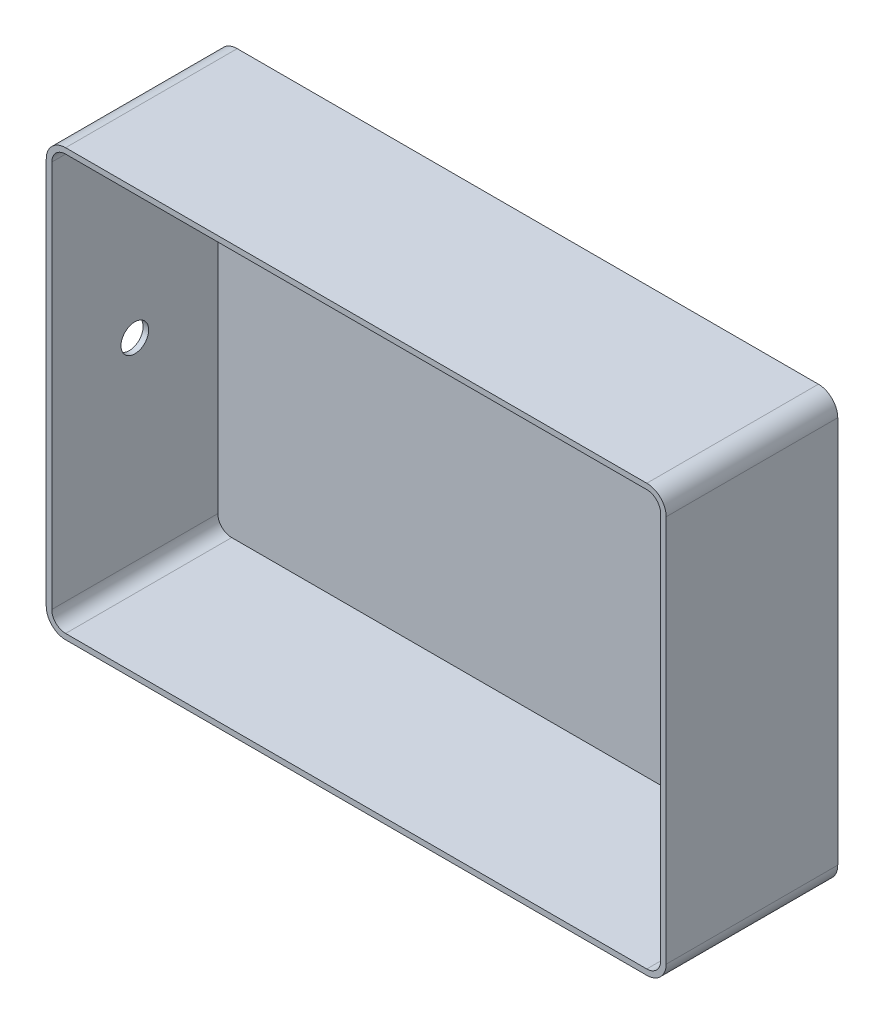
ISO-10303-21;
HEADER;
FILE_DESCRIPTION(('STEP AP214'),'2;1');
FILE_NAME('part.step','',(''),(''),'','','');
FILE_SCHEMA(('AUTOMOTIVE_DESIGN { 1 0 10303 214 1 1 1 1 }'));
ENDSEC;
DATA;
#1=APPLICATION_CONTEXT('core data for automotive mechanical design processes');
#2=APPLICATION_PROTOCOL_DEFINITION('international standard','automotive_design',2000,#1);
#3=PRODUCT_CONTEXT('',#1,'mechanical');
#4=PRODUCT('Part','Part','',(#3));
#5=PRODUCT_RELATED_PRODUCT_CATEGORY('part','',(#4));
#6=PRODUCT_DEFINITION_FORMATION('','',#4);
#7=PRODUCT_DEFINITION_CONTEXT('part definition',#1,'design');
#8=PRODUCT_DEFINITION('design','',#6,#7);
#9=PRODUCT_DEFINITION_SHAPE('','',#8);
#10=(LENGTH_UNIT() NAMED_UNIT(*) SI_UNIT(.MILLI.,.METRE.));
#11=(NAMED_UNIT(*) PLANE_ANGLE_UNIT() SI_UNIT($,.RADIAN.));
#12=(NAMED_UNIT(*) SI_UNIT($,.STERADIAN.) SOLID_ANGLE_UNIT());
#13=UNCERTAINTY_MEASURE_WITH_UNIT(LENGTH_MEASURE(1.E-05),#10,'distance_accuracy_value','');
#14=(GEOMETRIC_REPRESENTATION_CONTEXT(3) GLOBAL_UNCERTAINTY_ASSIGNED_CONTEXT((#13)) GLOBAL_UNIT_ASSIGNED_CONTEXT((#10,
#11,#12)) REPRESENTATION_CONTEXT('',''));
#15=CARTESIAN_POINT('',(0.,0.,0.));
#16=DIRECTION('',(0.,0.,1.));
#17=DIRECTION('',(1.,0.,0.));
#18=AXIS2_PLACEMENT_3D('',#15,#16,#17);
#19=CARTESIAN_POINT('',(105.,-70.,30.));
#20=DIRECTION('',(0.,0.,-1.));
#21=DIRECTION('',(-1.,0.,0.));
#22=AXIS2_PLACEMENT_3D('',#19,#20,#21);
#23=CYLINDRICAL_SURFACE('',#22,7.);
#24=CARTESIAN_POINT('',(105.,-70.,-32.));
#25=DIRECTION('',(0.,0.,1.));
#26=DIRECTION('',(1.,0.,0.));
#27=AXIS2_PLACEMENT_3D('',#24,#25,#26);
#28=CIRCLE('',#27,7.);
#29=CARTESIAN_POINT('',(105.,-77.,-32.));
#30=VERTEX_POINT('',#29);
#31=CARTESIAN_POINT('',(112.,-69.9999999999999,-32.));
#32=VERTEX_POINT('',#31);
#33=EDGE_CURVE('E186',#30,#32,#28,.T.);
#34=ORIENTED_EDGE('',*,*,#33,.T.);
#35=DIRECTION('',(0.,0.,1.));
#36=VECTOR('',#35,1.);
#37=CARTESIAN_POINT('',(112.,-69.9999999999999,30.));
#38=LINE('',#37,#36);
#39=CARTESIAN_POINT('',(112.,-69.9999999999999,30.));
#40=VERTEX_POINT('',#39);
#41=EDGE_CURVE('E11',#40,#32,#38,.F.);
#42=ORIENTED_EDGE('',*,*,#41,.F.);
#43=CARTESIAN_POINT('',(105.,-70.,30.));
#44=DIRECTION('',(0.,0.,1.));
#45=DIRECTION('',(1.,0.,0.));
#46=AXIS2_PLACEMENT_3D('',#43,#44,#45);
#47=CIRCLE('',#46,7.);
#48=CARTESIAN_POINT('',(105.,-77.,30.));
#49=VERTEX_POINT('',#48);
#50=EDGE_CURVE('E309',#49,#40,#47,.T.);
#51=ORIENTED_EDGE('',*,*,#50,.F.);
#52=DIRECTION('',(0.,0.,-1.));
#53=VECTOR('',#52,1.);
#54=CARTESIAN_POINT('',(105.,-77.,30.));
#55=LINE('',#54,#53);
#56=EDGE_CURVE('E262',#49,#30,#55,.T.);
#57=ORIENTED_EDGE('',*,*,#56,.T.);
#58=EDGE_LOOP('',(#34,#42,#51,#57));
#59=FACE_BOUND('',#58,.T.);
#60=ADVANCED_FACE('F46',(#59),#23,.T.);
#61=CARTESIAN_POINT('',(112.,-69.9999999999999,30.));
#62=DIRECTION('',(-1.,0.,0.));
#63=DIRECTION('',(0.,-1.,0.));
#64=AXIS2_PLACEMENT_3D('',#61,#62,#63);
#65=PLANE('',#64);
#66=DIRECTION('',(0.,1.,0.));
#67=VECTOR('',#66,1.);
#68=CARTESIAN_POINT('',(112.,-69.9999999999999,-32.));
#69=LINE('',#68,#67);
#70=CARTESIAN_POINT('',(112.,70.,-32.));
#71=VERTEX_POINT('',#70);
#72=EDGE_CURVE('E260',#32,#71,#69,.T.);
#73=ORIENTED_EDGE('',*,*,#72,.T.);
#74=DIRECTION('',(0.,0.,-1.));
#75=VECTOR('',#74,1.);
#76=CARTESIAN_POINT('',(112.,70.,30.));
#77=LINE('',#76,#75);
#78=CARTESIAN_POINT('',(112.,70.,30.));
#79=VERTEX_POINT('',#78);
#80=EDGE_CURVE('E56',#79,#71,#77,.T.);
#81=ORIENTED_EDGE('',*,*,#80,.F.);
#82=DIRECTION('',(0.,1.,0.));
#83=VECTOR('',#82,1.);
#84=CARTESIAN_POINT('',(112.,-69.9999999999999,30.));
#85=LINE('',#84,#83);
#86=EDGE_CURVE('E312',#40,#79,#85,.T.);
#87=ORIENTED_EDGE('',*,*,#86,.F.);
#88=ORIENTED_EDGE('',*,*,#41,.T.);
#89=EDGE_LOOP('',(#73,#81,#87,#88));
#90=FACE_BOUND('',#89,.T.);
#91=ADVANCED_FACE('F348',(#90),#65,.F.);
#92=CARTESIAN_POINT('',(105.,70.,30.));
#93=DIRECTION('',(0.,0.,-1.));
#94=DIRECTION('',(-1.,0.,0.));
#95=AXIS2_PLACEMENT_3D('',#92,#93,#94);
#96=CYLINDRICAL_SURFACE('',#95,7.);
#97=CARTESIAN_POINT('',(105.,70.,-32.));
#98=DIRECTION('',(0.,0.,1.));
#99=DIRECTION('',(1.,0.,0.));
#100=AXIS2_PLACEMENT_3D('',#97,#98,#99);
#101=CIRCLE('',#100,7.);
#102=CARTESIAN_POINT('',(105.,77.,-32.));
#103=VERTEX_POINT('',#102);
#104=EDGE_CURVE('E269',#71,#103,#101,.T.);
#105=ORIENTED_EDGE('',*,*,#104,.T.);
#106=DIRECTION('',(0.,0.,1.));
#107=VECTOR('',#106,1.);
#108=CARTESIAN_POINT('',(105.,77.,30.));
#109=LINE('',#108,#107);
#110=CARTESIAN_POINT('',(105.,77.,30.));
#111=VERTEX_POINT('',#110);
#112=EDGE_CURVE('E273',#111,#103,#109,.F.);
#113=ORIENTED_EDGE('',*,*,#112,.F.);
#114=CARTESIAN_POINT('',(105.,70.,30.));
#115=DIRECTION('',(0.,0.,1.));
#116=DIRECTION('',(1.,0.,0.));
#117=AXIS2_PLACEMENT_3D('',#114,#115,#116);
#118=CIRCLE('',#117,7.);
#119=EDGE_CURVE('E315',#79,#111,#118,.T.);
#120=ORIENTED_EDGE('',*,*,#119,.F.);
#121=ORIENTED_EDGE('',*,*,#80,.T.);
#122=EDGE_LOOP('',(#105,#113,#120,#121));
#123=FACE_BOUND('',#122,.T.);
#124=ADVANCED_FACE('F351',(#123),#96,.T.);
#125=CARTESIAN_POINT('',(-105.,77.,30.));
#126=DIRECTION('',(0.,-1.,0.));
#127=DIRECTION('',(1.,0.,0.));
#128=AXIS2_PLACEMENT_3D('',#125,#126,#127);
#129=PLANE('',#128);
#130=DIRECTION('',(-1.,0.,0.));
#131=VECTOR('',#130,1.);
#132=CARTESIAN_POINT('',(-105.,77.,-32.));
#133=LINE('',#132,#131);
#134=CARTESIAN_POINT('',(-105.,77.,-32.));
#135=VERTEX_POINT('',#134);
#136=EDGE_CURVE('E276',#103,#135,#133,.T.);
#137=ORIENTED_EDGE('',*,*,#136,.T.);
#138=DIRECTION('',(0.,0.,-1.));
#139=VECTOR('',#138,1.);
#140=CARTESIAN_POINT('',(-105.,77.,30.));
#141=LINE('',#140,#139);
#142=CARTESIAN_POINT('',(-105.,77.,30.));
#143=VERTEX_POINT('',#142);
#144=EDGE_CURVE('E280',#143,#135,#141,.T.);
#145=ORIENTED_EDGE('',*,*,#144,.F.);
#146=DIRECTION('',(-1.,0.,0.));
#147=VECTOR('',#146,1.);
#148=CARTESIAN_POINT('',(-105.,77.,30.));
#149=LINE('',#148,#147);
#150=EDGE_CURVE('E318',#111,#143,#149,.T.);
#151=ORIENTED_EDGE('',*,*,#150,.F.);
#152=ORIENTED_EDGE('',*,*,#112,.T.);
#153=EDGE_LOOP('',(#137,#145,#151,#152));
#154=FACE_BOUND('',#153,.T.);
#155=ADVANCED_FACE('F356',(#154),#129,.F.);
#156=CARTESIAN_POINT('',(-105.,70.,30.));
#157=DIRECTION('',(0.,0.,-1.));
#158=DIRECTION('',(-1.,0.,0.));
#159=AXIS2_PLACEMENT_3D('',#156,#157,#158);
#160=CYLINDRICAL_SURFACE('',#159,7.);
#161=CARTESIAN_POINT('',(-105.,70.,-32.));
#162=DIRECTION('',(0.,0.,1.));
#163=DIRECTION('',(1.,0.,0.));
#164=AXIS2_PLACEMENT_3D('',#161,#162,#163);
#165=CIRCLE('',#164,7.);
#166=CARTESIAN_POINT('',(-112.,70.,-32.));
#167=VERTEX_POINT('',#166);
#168=EDGE_CURVE('E283',#135,#167,#165,.T.);
#169=ORIENTED_EDGE('',*,*,#168,.T.);
#170=DIRECTION('',(0.,0.,1.));
#171=VECTOR('',#170,1.);
#172=CARTESIAN_POINT('',(-112.,70.,30.));
#173=LINE('',#172,#171);
#174=CARTESIAN_POINT('',(-112.,70.,30.));
#175=VERTEX_POINT('',#174);
#176=EDGE_CURVE('E287',#175,#167,#173,.F.);
#177=ORIENTED_EDGE('',*,*,#176,.F.);
#178=CARTESIAN_POINT('',(-105.,70.,30.));
#179=DIRECTION('',(0.,0.,1.));
#180=DIRECTION('',(1.,0.,0.));
#181=AXIS2_PLACEMENT_3D('',#178,#179,#180);
#182=CIRCLE('',#181,7.);
#183=EDGE_CURVE('E321',#143,#175,#182,.T.);
#184=ORIENTED_EDGE('',*,*,#183,.F.);
#185=ORIENTED_EDGE('',*,*,#144,.T.);
#186=EDGE_LOOP('',(#169,#177,#184,#185));
#187=FACE_BOUND('',#186,.T.);
#188=ADVANCED_FACE('F360',(#187),#160,.T.);
#189=CARTESIAN_POINT('',(-112.,-69.9999999999999,30.));
#190=DIRECTION('',(1.,0.,0.));
#191=DIRECTION('',(0.,1.,0.));
#192=AXIS2_PLACEMENT_3D('',#189,#190,#191);
#193=PLANE('',#192);
#194=CARTESIAN_POINT('',(-112.,0.,0.));
#195=DIRECTION('',(-1.,0.,0.));
#196=DIRECTION('',(0.,-1.,0.));
#197=AXIS2_PLACEMENT_3D('',#194,#195,#196);
#198=CIRCLE('',#197,5.);
#199=CARTESIAN_POINT('',(-112.,-5.00000000000001,0.));
#200=VERTEX_POINT('',#199);
#201=EDGE_CURVE('E538',#200,#200,#198,.T.);
#202=ORIENTED_EDGE('',*,*,#201,.F.);
#203=EDGE_LOOP('',(#202));
#204=FACE_BOUND('',#203,.T.);
#205=DIRECTION('',(0.,-1.,0.));
#206=VECTOR('',#205,1.);
#207=CARTESIAN_POINT('',(-112.,-69.9999999999999,-32.));
#208=LINE('',#207,#206);
#209=CARTESIAN_POINT('',(-112.,-70.,-32.));
#210=VERTEX_POINT('',#209);
#211=EDGE_CURVE('E290',#167,#210,#208,.T.);
#212=ORIENTED_EDGE('',*,*,#211,.T.);
#213=DIRECTION('',(0.,0.,-1.));
#214=VECTOR('',#213,1.);
#215=CARTESIAN_POINT('',(-112.,-70.,30.));
#216=LINE('',#215,#214);
#217=CARTESIAN_POINT('',(-112.,-70.,30.));
#218=VERTEX_POINT('',#217);
#219=EDGE_CURVE('E294',#218,#210,#216,.T.);
#220=ORIENTED_EDGE('',*,*,#219,.F.);
#221=DIRECTION('',(0.,-1.,0.));
#222=VECTOR('',#221,1.);
#223=CARTESIAN_POINT('',(-112.,-69.9999999999999,30.));
#224=LINE('',#223,#222);
#225=EDGE_CURVE('E324',#175,#218,#224,.T.);
#226=ORIENTED_EDGE('',*,*,#225,.F.);
#227=ORIENTED_EDGE('',*,*,#176,.T.);
#228=EDGE_LOOP('',(#212,#220,#226,#227));
#229=FACE_BOUND('',#228,.T.);
#230=ADVANCED_FACE('F364',(#204,#229),#193,.F.);
#231=CARTESIAN_POINT('',(-105.,-70.,30.));
#232=DIRECTION('',(0.,0.,-1.));
#233=DIRECTION('',(-1.,0.,0.));
#234=AXIS2_PLACEMENT_3D('',#231,#232,#233);
#235=CYLINDRICAL_SURFACE('',#234,7.);
#236=CARTESIAN_POINT('',(-105.,-70.,-32.));
#237=DIRECTION('',(0.,0.,1.));
#238=DIRECTION('',(1.,0.,0.));
#239=AXIS2_PLACEMENT_3D('',#236,#237,#238);
#240=CIRCLE('',#239,7.);
#241=CARTESIAN_POINT('',(-105.,-77.,-32.));
#242=VERTEX_POINT('',#241);
#243=EDGE_CURVE('E297',#210,#242,#240,.T.);
#244=ORIENTED_EDGE('',*,*,#243,.T.);
#245=DIRECTION('',(0.,0.,1.));
#246=VECTOR('',#245,1.);
#247=CARTESIAN_POINT('',(-105.,-77.,30.));
#248=LINE('',#247,#246);
#249=CARTESIAN_POINT('',(-105.,-77.,30.));
#250=VERTEX_POINT('',#249);
#251=EDGE_CURVE('E266',#250,#242,#248,.F.);
#252=ORIENTED_EDGE('',*,*,#251,.F.);
#253=CARTESIAN_POINT('',(-105.,-70.,30.));
#254=DIRECTION('',(0.,0.,1.));
#255=DIRECTION('',(1.,0.,0.));
#256=AXIS2_PLACEMENT_3D('',#253,#254,#255);
#257=CIRCLE('',#256,7.);
#258=EDGE_CURVE('E327',#218,#250,#257,.T.);
#259=ORIENTED_EDGE('',*,*,#258,.F.);
#260=ORIENTED_EDGE('',*,*,#219,.T.);
#261=EDGE_LOOP('',(#244,#252,#259,#260));
#262=FACE_BOUND('',#261,.T.);
#263=ADVANCED_FACE('F335',(#262),#235,.T.);
#264=CARTESIAN_POINT('',(-105.,-77.,30.));
#265=DIRECTION('',(0.,1.,0.));
#266=DIRECTION('',(0.,0.,1.));
#267=AXIS2_PLACEMENT_3D('',#264,#265,#266);
#268=PLANE('',#267);
#269=DIRECTION('',(1.,0.,0.));
#270=VECTOR('',#269,1.);
#271=CARTESIAN_POINT('',(-105.,-77.,-32.));
#272=LINE('',#271,#270);
#273=EDGE_CURVE('E303',#242,#30,#272,.T.);
#274=ORIENTED_EDGE('',*,*,#273,.T.);
#275=ORIENTED_EDGE('',*,*,#56,.F.);
#276=DIRECTION('',(1.,0.,0.));
#277=VECTOR('',#276,1.);
#278=CARTESIAN_POINT('',(-105.,-77.,30.));
#279=LINE('',#278,#277);
#280=EDGE_CURVE('E72',#250,#49,#279,.T.);
#281=ORIENTED_EDGE('',*,*,#280,.F.);
#282=ORIENTED_EDGE('',*,*,#251,.T.);
#283=EDGE_LOOP('',(#274,#275,#281,#282));
#284=FACE_BOUND('',#283,.T.);
#285=ADVANCED_FACE('F339',(#284),#268,.F.);
#286=CARTESIAN_POINT('',(105.,-70.,30.));
#287=DIRECTION('',(0.,0.,1.));
#288=DIRECTION('',(1.,0.,0.));
#289=AXIS2_PLACEMENT_3D('',#286,#287,#288);
#290=PLANE('',#289);
#291=CARTESIAN_POINT('',(105.,-70.,30.));
#292=DIRECTION('',(0.,0.,1.));
#293=DIRECTION('',(1.,0.,0.));
#294=AXIS2_PLACEMENT_3D('',#291,#292,#293);
#295=CIRCLE('',#294,5.);
#296=CARTESIAN_POINT('',(105.,-75.,30.));
#297=VERTEX_POINT('',#296);
#298=CARTESIAN_POINT('',(110.,-69.9999999999999,30.));
#299=VERTEX_POINT('',#298);
#300=EDGE_CURVE('E165',#297,#299,#295,.T.);
#301=ORIENTED_EDGE('',*,*,#300,.F.);
#302=DIRECTION('',(1.,0.,0.));
#303=VECTOR('',#302,1.);
#304=CARTESIAN_POINT('',(-105.,-75.,30.));
#305=LINE('',#304,#303);
#306=CARTESIAN_POINT('',(-105.,-75.,30.));
#307=VERTEX_POINT('',#306);
#308=EDGE_CURVE('E211',#307,#297,#305,.T.);
#309=ORIENTED_EDGE('',*,*,#308,.F.);
#310=CARTESIAN_POINT('',(-105.,-70.,30.));
#311=DIRECTION('',(0.,0.,1.));
#312=DIRECTION('',(-1.,0.,0.));
#313=AXIS2_PLACEMENT_3D('',#310,#311,#312);
#314=CIRCLE('',#313,5.);
#315=CARTESIAN_POINT('',(-110.,-70.,30.));
#316=VERTEX_POINT('',#315);
#317=EDGE_CURVE('E208',#316,#307,#314,.T.);
#318=ORIENTED_EDGE('',*,*,#317,.F.);
#319=DIRECTION('',(0.,-1.,0.));
#320=VECTOR('',#319,1.);
#321=CARTESIAN_POINT('',(-110.,-69.9999999999999,30.));
#322=LINE('',#321,#320);
#323=CARTESIAN_POINT('',(-110.,70.,30.));
#324=VERTEX_POINT('',#323);
#325=EDGE_CURVE('E205',#324,#316,#322,.T.);
#326=ORIENTED_EDGE('',*,*,#325,.F.);
#327=CARTESIAN_POINT('',(-105.,70.,30.));
#328=DIRECTION('',(0.,0.,1.));
#329=DIRECTION('',(-1.,0.,0.));
#330=AXIS2_PLACEMENT_3D('',#327,#328,#329);
#331=CIRCLE('',#330,5.);
#332=CARTESIAN_POINT('',(-105.,75.,30.));
#333=VERTEX_POINT('',#332);
#334=EDGE_CURVE('E202',#333,#324,#331,.T.);
#335=ORIENTED_EDGE('',*,*,#334,.F.);
#336=DIRECTION('',(-1.,0.,0.));
#337=VECTOR('',#336,1.);
#338=CARTESIAN_POINT('',(-105.,75.,30.));
#339=LINE('',#338,#337);
#340=CARTESIAN_POINT('',(105.,75.,30.));
#341=VERTEX_POINT('',#340);
#342=EDGE_CURVE('E196',#341,#333,#339,.T.);
#343=ORIENTED_EDGE('',*,*,#342,.F.);
#344=CARTESIAN_POINT('',(105.,70.,30.));
#345=DIRECTION('',(0.,0.,1.));
#346=DIRECTION('',(-1.,0.,0.));
#347=AXIS2_PLACEMENT_3D('',#344,#345,#346);
#348=CIRCLE('',#347,5.);
#349=CARTESIAN_POINT('',(110.,70.,30.));
#350=VERTEX_POINT('',#349);
#351=EDGE_CURVE('E192',#350,#341,#348,.T.);
#352=ORIENTED_EDGE('',*,*,#351,.F.);
#353=DIRECTION('',(0.,1.,0.));
#354=VECTOR('',#353,1.);
#355=CARTESIAN_POINT('',(110.,-69.9999999999999,30.));
#356=LINE('',#355,#354);
#357=EDGE_CURVE('E177',#299,#350,#356,.T.);
#358=ORIENTED_EDGE('',*,*,#357,.F.);
#359=EDGE_LOOP('',(#301,#309,#318,#326,#335,#343,#352,#358));
#360=FACE_BOUND('',#359,.T.);
#361=ORIENTED_EDGE('',*,*,#50,.T.);
#362=ORIENTED_EDGE('',*,*,#86,.T.);
#363=ORIENTED_EDGE('',*,*,#119,.T.);
#364=ORIENTED_EDGE('',*,*,#150,.T.);
#365=ORIENTED_EDGE('',*,*,#183,.T.);
#366=ORIENTED_EDGE('',*,*,#225,.T.);
#367=ORIENTED_EDGE('',*,*,#258,.T.);
#368=ORIENTED_EDGE('',*,*,#280,.T.);
#369=EDGE_LOOP('',(#361,#362,#363,#364,#365,#366,#367,#368));
#370=FACE_BOUND('',#369,.T.);
#371=ADVANCED_FACE('F190',(#360,#370),#290,.T.);
#372=CARTESIAN_POINT('',(105.,-70.,-32.));
#373=DIRECTION('',(0.,0.,1.));
#374=DIRECTION('',(1.,0.,0.));
#375=AXIS2_PLACEMENT_3D('',#372,#373,#374);
#376=PLANE('',#375);
#377=ORIENTED_EDGE('',*,*,#33,.F.);
#378=ORIENTED_EDGE('',*,*,#273,.F.);
#379=ORIENTED_EDGE('',*,*,#243,.F.);
#380=ORIENTED_EDGE('',*,*,#211,.F.);
#381=ORIENTED_EDGE('',*,*,#168,.F.);
#382=ORIENTED_EDGE('',*,*,#136,.F.);
#383=ORIENTED_EDGE('',*,*,#104,.F.);
#384=ORIENTED_EDGE('',*,*,#72,.F.);
#385=EDGE_LOOP('',(#377,#378,#379,#380,#381,#382,#383,#384));
#386=FACE_BOUND('',#385,.T.);
#387=ADVANCED_FACE('F48',(#386),#376,.F.);
#388=CARTESIAN_POINT('',(105.,-70.,30.));
#389=DIRECTION('',(0.,0.,-1.));
#390=DIRECTION('',(-1.,0.,0.));
#391=AXIS2_PLACEMENT_3D('',#388,#389,#390);
#392=CYLINDRICAL_SURFACE('',#391,5.);
#393=CARTESIAN_POINT('',(105.,-70.,-30.));
#394=DIRECTION('',(0.,0.,1.));
#395=DIRECTION('',(1.,0.,0.));
#396=AXIS2_PLACEMENT_3D('',#393,#394,#395);
#397=CIRCLE('',#396,5.);
#398=CARTESIAN_POINT('',(105.,-75.,-30.));
#399=VERTEX_POINT('',#398);
#400=CARTESIAN_POINT('',(110.,-69.9999999999999,-30.));
#401=VERTEX_POINT('',#400);
#402=EDGE_CURVE('E214',#399,#401,#397,.T.);
#403=ORIENTED_EDGE('',*,*,#402,.F.);
#404=DIRECTION('',(0.,0.,-1.));
#405=VECTOR('',#404,1.);
#406=CARTESIAN_POINT('',(105.,-75.,30.));
#407=LINE('',#406,#405);
#408=EDGE_CURVE('E172',#297,#399,#407,.T.);
#409=ORIENTED_EDGE('',*,*,#408,.F.);
#410=ORIENTED_EDGE('',*,*,#300,.T.);
#411=DIRECTION('',(0.,0.,-1.));
#412=VECTOR('',#411,1.);
#413=CARTESIAN_POINT('',(110.,-69.9999999999999,30.));
#414=LINE('',#413,#412);
#415=EDGE_CURVE('E169',#299,#401,#414,.T.);
#416=ORIENTED_EDGE('',*,*,#415,.T.);
#417=EDGE_LOOP('',(#403,#409,#410,#416));
#418=FACE_BOUND('',#417,.T.);
#419=ADVANCED_FACE('F168',(#418),#392,.F.);
#420=CARTESIAN_POINT('',(110.,-69.9999999999999,30.));
#421=DIRECTION('',(-1.,0.,0.));
#422=DIRECTION('',(0.,-1.,0.));
#423=AXIS2_PLACEMENT_3D('',#420,#421,#422);
#424=PLANE('',#423);
#425=DIRECTION('',(0.,1.,0.));
#426=VECTOR('',#425,1.);
#427=CARTESIAN_POINT('',(110.,-69.9999999999999,-30.));
#428=LINE('',#427,#426);
#429=CARTESIAN_POINT('',(110.,70.,-30.));
#430=VERTEX_POINT('',#429);
#431=EDGE_CURVE('E184',#401,#430,#428,.T.);
#432=ORIENTED_EDGE('',*,*,#431,.F.);
#433=ORIENTED_EDGE('',*,*,#415,.F.);
#434=ORIENTED_EDGE('',*,*,#357,.T.);
#435=DIRECTION('',(0.,0.,-1.));
#436=VECTOR('',#435,1.);
#437=CARTESIAN_POINT('',(110.,70.,30.));
#438=LINE('',#437,#436);
#439=EDGE_CURVE('E187',#350,#430,#438,.T.);
#440=ORIENTED_EDGE('',*,*,#439,.T.);
#441=EDGE_LOOP('',(#432,#433,#434,#440));
#442=FACE_BOUND('',#441,.T.);
#443=ADVANCED_FACE('F181',(#442),#424,.T.);
#444=CARTESIAN_POINT('',(105.,70.,30.));
#445=DIRECTION('',(0.,0.,-1.));
#446=DIRECTION('',(-1.,0.,0.));
#447=AXIS2_PLACEMENT_3D('',#444,#445,#446);
#448=CYLINDRICAL_SURFACE('',#447,5.);
#449=CARTESIAN_POINT('',(105.,70.,-30.));
#450=DIRECTION('',(0.,0.,1.));
#451=DIRECTION('',(-1.,0.,0.));
#452=AXIS2_PLACEMENT_3D('',#449,#450,#451);
#453=CIRCLE('',#452,5.);
#454=CARTESIAN_POINT('',(105.,75.,-30.));
#455=VERTEX_POINT('',#454);
#456=EDGE_CURVE('E219',#430,#455,#453,.T.);
#457=ORIENTED_EDGE('',*,*,#456,.F.);
#458=ORIENTED_EDGE('',*,*,#439,.F.);
#459=ORIENTED_EDGE('',*,*,#351,.T.);
#460=DIRECTION('',(0.,0.,-1.));
#461=VECTOR('',#460,1.);
#462=CARTESIAN_POINT('',(105.,75.,30.));
#463=LINE('',#462,#461);
#464=EDGE_CURVE('E252',#341,#455,#463,.T.);
#465=ORIENTED_EDGE('',*,*,#464,.T.);
#466=EDGE_LOOP('',(#457,#458,#459,#465));
#467=FACE_BOUND('',#466,.T.);
#468=ADVANCED_FACE('F416',(#467),#448,.F.);
#469=CARTESIAN_POINT('',(-105.,75.,30.));
#470=DIRECTION('',(0.,-1.,0.));
#471=DIRECTION('',(1.,0.,0.));
#472=AXIS2_PLACEMENT_3D('',#469,#470,#471);
#473=PLANE('',#472);
#474=DIRECTION('',(-1.,0.,0.));
#475=VECTOR('',#474,1.);
#476=CARTESIAN_POINT('',(-105.,75.,-30.));
#477=LINE('',#476,#475);
#478=CARTESIAN_POINT('',(-105.,75.,-30.));
#479=VERTEX_POINT('',#478);
#480=EDGE_CURVE('E222',#455,#479,#477,.T.);
#481=ORIENTED_EDGE('',*,*,#480,.F.);
#482=ORIENTED_EDGE('',*,*,#464,.F.);
#483=ORIENTED_EDGE('',*,*,#342,.T.);
#484=DIRECTION('',(0.,0.,-1.));
#485=VECTOR('',#484,1.);
#486=CARTESIAN_POINT('',(-105.,75.,30.));
#487=LINE('',#486,#485);
#488=EDGE_CURVE('E248',#333,#479,#487,.T.);
#489=ORIENTED_EDGE('',*,*,#488,.T.);
#490=EDGE_LOOP('',(#481,#482,#483,#489));
#491=FACE_BOUND('',#490,.T.);
#492=ADVANCED_FACE('F424',(#491),#473,.T.);
#493=CARTESIAN_POINT('',(-105.,70.,30.));
#494=DIRECTION('',(0.,0.,-1.));
#495=DIRECTION('',(-1.,0.,0.));
#496=AXIS2_PLACEMENT_3D('',#493,#494,#495);
#497=CYLINDRICAL_SURFACE('',#496,5.);
#498=CARTESIAN_POINT('',(-105.,70.,-30.));
#499=DIRECTION('',(0.,0.,1.));
#500=DIRECTION('',(-1.,0.,0.));
#501=AXIS2_PLACEMENT_3D('',#498,#499,#500);
#502=CIRCLE('',#501,5.);
#503=CARTESIAN_POINT('',(-110.,70.,-30.));
#504=VERTEX_POINT('',#503);
#505=EDGE_CURVE('E225',#479,#504,#502,.T.);
#506=ORIENTED_EDGE('',*,*,#505,.F.);
#507=ORIENTED_EDGE('',*,*,#488,.F.);
#508=ORIENTED_EDGE('',*,*,#334,.T.);
#509=DIRECTION('',(0.,0.,-1.));
#510=VECTOR('',#509,1.);
#511=CARTESIAN_POINT('',(-110.,70.,30.));
#512=LINE('',#511,#510);
#513=EDGE_CURVE('E244',#324,#504,#512,.T.);
#514=ORIENTED_EDGE('',*,*,#513,.T.);
#515=EDGE_LOOP('',(#506,#507,#508,#514));
#516=FACE_BOUND('',#515,.T.);
#517=ADVANCED_FACE('F433',(#516),#497,.F.);
#518=CARTESIAN_POINT('',(-110.,-69.9999999999999,30.));
#519=DIRECTION('',(1.,0.,0.));
#520=DIRECTION('',(0.,1.,0.));
#521=AXIS2_PLACEMENT_3D('',#518,#519,#520);
#522=PLANE('',#521);
#523=CARTESIAN_POINT('',(-110.,0.,0.));
#524=DIRECTION('',(1.,0.,0.));
#525=DIRECTION('',(0.,1.,0.));
#526=AXIS2_PLACEMENT_3D('',#523,#524,#525);
#527=CIRCLE('',#526,5.);
#528=CARTESIAN_POINT('',(-110.,4.99999999999999,0.));
#529=VERTEX_POINT('',#528);
#530=EDGE_CURVE('E50',#529,#529,#527,.T.);
#531=ORIENTED_EDGE('',*,*,#530,.F.);
#532=EDGE_LOOP('',(#531));
#533=FACE_BOUND('',#532,.T.);
#534=DIRECTION('',(0.,-1.,0.));
#535=VECTOR('',#534,1.);
#536=CARTESIAN_POINT('',(-110.,-69.9999999999999,-30.));
#537=LINE('',#536,#535);
#538=CARTESIAN_POINT('',(-110.,-70.,-30.));
#539=VERTEX_POINT('',#538);
#540=EDGE_CURVE('E228',#504,#539,#537,.T.);
#541=ORIENTED_EDGE('',*,*,#540,.F.);
#542=ORIENTED_EDGE('',*,*,#513,.F.);
#543=ORIENTED_EDGE('',*,*,#325,.T.);
#544=DIRECTION('',(0.,0.,-1.));
#545=VECTOR('',#544,1.);
#546=CARTESIAN_POINT('',(-110.,-70.,30.));
#547=LINE('',#546,#545);
#548=EDGE_CURVE('E240',#316,#539,#547,.T.);
#549=ORIENTED_EDGE('',*,*,#548,.T.);
#550=EDGE_LOOP('',(#541,#542,#543,#549));
#551=FACE_BOUND('',#550,.T.);
#552=ADVANCED_FACE('F442',(#533,#551),#522,.T.);
#553=CARTESIAN_POINT('',(-105.,-70.,30.));
#554=DIRECTION('',(0.,0.,-1.));
#555=DIRECTION('',(-1.,0.,0.));
#556=AXIS2_PLACEMENT_3D('',#553,#554,#555);
#557=CYLINDRICAL_SURFACE('',#556,5.);
#558=CARTESIAN_POINT('',(-105.,-70.,-30.));
#559=DIRECTION('',(0.,0.,1.));
#560=DIRECTION('',(-1.,0.,0.));
#561=AXIS2_PLACEMENT_3D('',#558,#559,#560);
#562=CIRCLE('',#561,5.);
#563=CARTESIAN_POINT('',(-105.,-75.,-30.));
#564=VERTEX_POINT('',#563);
#565=EDGE_CURVE('E231',#539,#564,#562,.T.);
#566=ORIENTED_EDGE('',*,*,#565,.F.);
#567=ORIENTED_EDGE('',*,*,#548,.F.);
#568=ORIENTED_EDGE('',*,*,#317,.T.);
#569=DIRECTION('',(0.,0.,-1.));
#570=VECTOR('',#569,1.);
#571=CARTESIAN_POINT('',(-105.,-75.,30.));
#572=LINE('',#571,#570);
#573=EDGE_CURVE('E64',#307,#564,#572,.T.);
#574=ORIENTED_EDGE('',*,*,#573,.T.);
#575=EDGE_LOOP('',(#566,#567,#568,#574));
#576=FACE_BOUND('',#575,.T.);
#577=ADVANCED_FACE('F451',(#576),#557,.F.);
#578=CARTESIAN_POINT('',(-105.,-75.,30.));
#579=DIRECTION('',(0.,1.,0.));
#580=DIRECTION('',(0.,0.,1.));
#581=AXIS2_PLACEMENT_3D('',#578,#579,#580);
#582=PLANE('',#581);
#583=DIRECTION('',(1.,0.,0.));
#584=VECTOR('',#583,1.);
#585=CARTESIAN_POINT('',(-105.,-75.,-30.));
#586=LINE('',#585,#584);
#587=EDGE_CURVE('E178',#564,#399,#586,.T.);
#588=ORIENTED_EDGE('',*,*,#587,.F.);
#589=ORIENTED_EDGE('',*,*,#573,.F.);
#590=ORIENTED_EDGE('',*,*,#308,.T.);
#591=ORIENTED_EDGE('',*,*,#408,.T.);
#592=EDGE_LOOP('',(#588,#589,#590,#591));
#593=FACE_BOUND('',#592,.T.);
#594=ADVANCED_FACE('F460',(#593),#582,.T.);
#595=CARTESIAN_POINT('',(105.,-70.,-30.));
#596=DIRECTION('',(0.,0.,1.));
#597=DIRECTION('',(1.,0.,0.));
#598=AXIS2_PLACEMENT_3D('',#595,#596,#597);
#599=PLANE('',#598);
#600=ORIENTED_EDGE('',*,*,#402,.T.);
#601=ORIENTED_EDGE('',*,*,#431,.T.);
#602=ORIENTED_EDGE('',*,*,#456,.T.);
#603=ORIENTED_EDGE('',*,*,#480,.T.);
#604=ORIENTED_EDGE('',*,*,#505,.T.);
#605=ORIENTED_EDGE('',*,*,#540,.T.);
#606=ORIENTED_EDGE('',*,*,#565,.T.);
#607=ORIENTED_EDGE('',*,*,#587,.T.);
#608=EDGE_LOOP('',(#600,#601,#602,#603,#604,#605,#606,#607));
#609=FACE_BOUND('',#608,.T.);
#610=ADVANCED_FACE('F469',(#609),#599,.T.);
#611=CARTESIAN_POINT('',(-62.,0.,0.));
#612=DIRECTION('',(-1.,0.,0.));
#613=DIRECTION('',(0.,-1.,0.));
#614=AXIS2_PLACEMENT_3D('',#611,#612,#613);
#615=CYLINDRICAL_SURFACE('',#614,5.);
#616=ORIENTED_EDGE('',*,*,#530,.T.);
#617=EDGE_LOOP('',(#616));
#618=FACE_BOUND('',#617,.T.);
#619=ORIENTED_EDGE('',*,*,#201,.T.);
#620=EDGE_LOOP('',(#619));
#621=FACE_BOUND('',#620,.T.);
#622=ADVANCED_FACE('F476',(#618,#621),#615,.F.);
#623=CLOSED_SHELL('',(#60,#91,#124,#155,#188,#230,#263,#285,#371,#387,#419,#443,#468,#492,#517,
#552,#577,#594,#610,#622));
#624=MANIFOLD_SOLID_BREP('B2',#623);
#625=ADVANCED_BREP_SHAPE_REPRESENTATION('',(#18,#624),#14);
#626=SHAPE_DEFINITION_REPRESENTATION(#9,#625);
ENDSEC;
END-ISO-10303-21;
